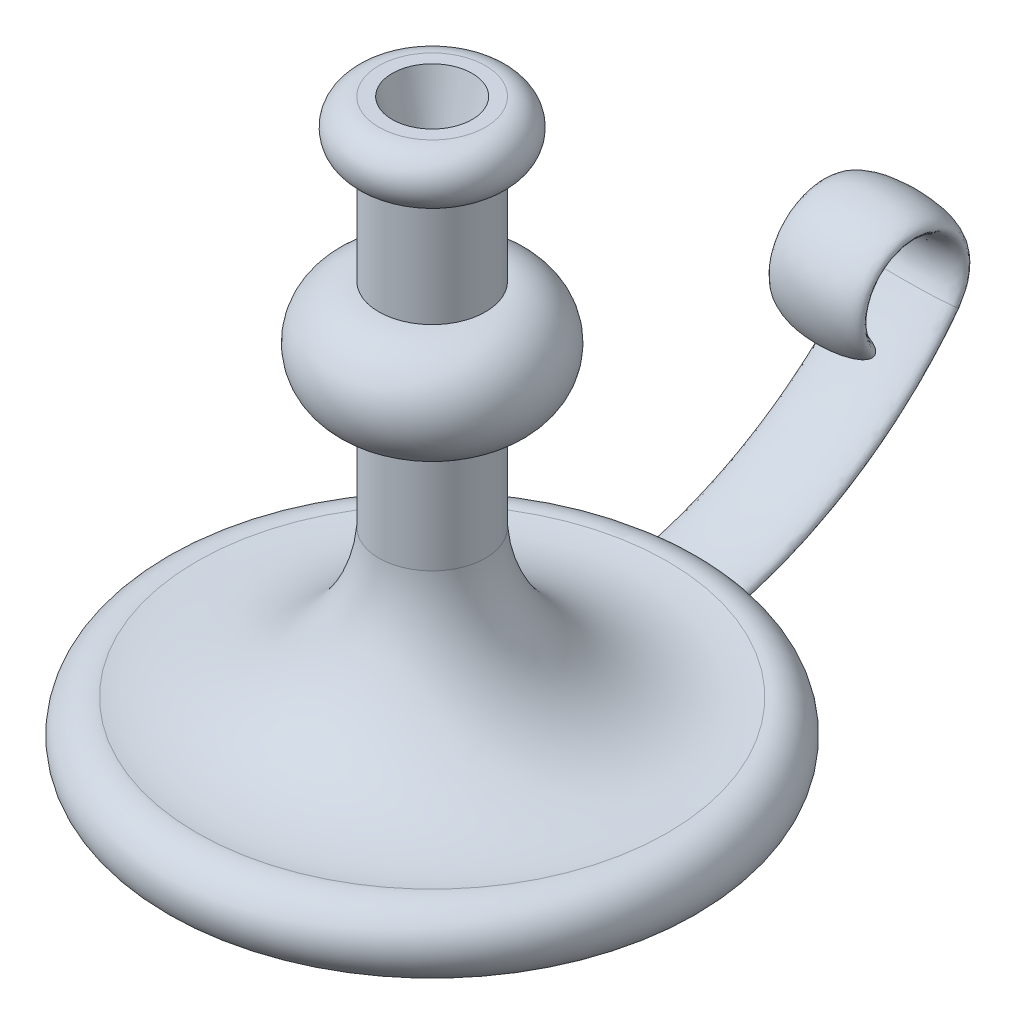
ISO-10303-21;
HEADER;
FILE_DESCRIPTION(('STEP AP214'),'2;1');
FILE_NAME('part.step','',(''),(''),'','','');
FILE_SCHEMA(('AUTOMOTIVE_DESIGN { 1 0 10303 214 1 1 1 1 }'));
ENDSEC;
DATA;
#1=APPLICATION_CONTEXT('core data for automotive mechanical design processes');
#2=APPLICATION_PROTOCOL_DEFINITION('international standard','automotive_design',2000,#1);
#3=PRODUCT_CONTEXT('',#1,'mechanical');
#4=PRODUCT('Part','Part','',(#3));
#5=PRODUCT_RELATED_PRODUCT_CATEGORY('part','',(#4));
#6=PRODUCT_DEFINITION_FORMATION('','',#4);
#7=PRODUCT_DEFINITION_CONTEXT('part definition',#1,'design');
#8=PRODUCT_DEFINITION('design','',#6,#7);
#9=PRODUCT_DEFINITION_SHAPE('','',#8);
#10=(LENGTH_UNIT() NAMED_UNIT(*) SI_UNIT(.MILLI.,.METRE.));
#11=(NAMED_UNIT(*) PLANE_ANGLE_UNIT() SI_UNIT($,.RADIAN.));
#12=(NAMED_UNIT(*) SI_UNIT($,.STERADIAN.) SOLID_ANGLE_UNIT());
#13=UNCERTAINTY_MEASURE_WITH_UNIT(LENGTH_MEASURE(1.E-05),#10,'distance_accuracy_value','');
#14=(GEOMETRIC_REPRESENTATION_CONTEXT(3) GLOBAL_UNCERTAINTY_ASSIGNED_CONTEXT((#13)) GLOBAL_UNIT_ASSIGNED_CONTEXT((#10,
#11,#12)) REPRESENTATION_CONTEXT('',''));
#15=CARTESIAN_POINT('',(0.,0.,0.));
#16=DIRECTION('',(0.,0.,1.));
#17=DIRECTION('',(1.,0.,0.));
#18=AXIS2_PLACEMENT_3D('',#15,#16,#17);
#19=CARTESIAN_POINT('',(0.,12.5,0.));
#20=DIRECTION('',(0.,1.,0.));
#21=DIRECTION('',(0.,0.,1.));
#22=AXIS2_PLACEMENT_3D('',#19,#20,#21);
#23=TOROIDAL_SURFACE('',#22,90.,12.5);
#24=CARTESIAN_POINT('',(0.,24.8768147133355,0.));
#25=DIRECTION('',(0.,1.,0.));
#26=DIRECTION('',(0.,0.,1.));
#27=AXIS2_PLACEMENT_3D('',#24,#25,#26);
#28=CIRCLE('',#27,88.2494407888445);
#29=CARTESIAN_POINT('',(0.,24.8768147133355,88.2494407888445));
#30=VERTEX_POINT('',#29);
#31=EDGE_CURVE('E78',#30,#30,#28,.T.);
#32=ORIENTED_EDGE('',*,*,#31,.F.);
#33=EDGE_LOOP('',(#32));
#34=FACE_BOUND('',#33,.T.);
#35=CARTESIAN_POINT('',(0.,0.,0.));
#36=DIRECTION('',(0.,1.,0.));
#37=DIRECTION('',(0.,0.,1.));
#38=AXIS2_PLACEMENT_3D('',#35,#36,#37);
#39=CIRCLE('',#38,90.);
#40=CARTESIAN_POINT('',(0.,0.,90.));
#41=VERTEX_POINT('',#40);
#42=EDGE_CURVE('E75',#41,#41,#39,.T.);
#43=ORIENTED_EDGE('',*,*,#42,.T.);
#44=EDGE_LOOP('',(#43));
#45=FACE_BOUND('',#44,.T.);
#46=CARTESIAN_POINT('',(-17.5,16.0927546606946,-100.459704957004));
#47=CARTESIAN_POINT('',(-17.4999997813937,16.1354081331705,-100.446712647398));
#48=CARTESIAN_POINT('',(-17.4979059100199,16.1780942344883,-100.433822006738));
#49=CARTESIAN_POINT('',(-17.4896076615809,16.2631476064876,-100.40835061694));
#50=CARTESIAN_POINT('',(-17.4834031158618,16.3055148640154,-100.395769880538));
#51=CARTESIAN_POINT('',(-17.4588636231115,16.4317069436548,-100.358601231694));
#52=CARTESIAN_POINT('',(-17.4346029926943,16.5145956736544,-100.334594903691));
#53=CARTESIAN_POINT('',(-17.3644857421467,16.6975652405625,-100.282370533929));
#54=CARTESIAN_POINT('',(-17.3145591280542,16.7962203137272,-100.254773339427));
#55=CARTESIAN_POINT('',(-17.1992119753299,16.9849169483652,-100.202807799272));
#56=CARTESIAN_POINT('',(-17.1337582407852,17.0749394668665,-100.178446548357));
#57=CARTESIAN_POINT('',(-17.0010895960041,17.2357164837937,-100.135510306638));
#58=CARTESIAN_POINT('',(-16.9351597791246,17.3074649207201,-100.116593510554));
#59=CARTESIAN_POINT('',(-16.7971627938564,17.445356362594,-100.080600163252));
#60=CARTESIAN_POINT('',(-16.7250906247138,17.5114947110188,-100.06352513762));
#61=CARTESIAN_POINT('',(-16.5762015876962,17.6389454303654,-100.030902059111));
#62=CARTESIAN_POINT('',(-16.4993735143119,17.7002455646839,-100.015357854801));
#63=CARTESIAN_POINT('',(-16.3422295543318,17.8184562605972,-99.9856014700973));
#64=CARTESIAN_POINT('',(-16.2619148289213,17.8753682663373,-99.9713888511401));
#65=CARTESIAN_POINT('',(-16.099476553963,17.984737451017,-99.9442451285127));
#66=CARTESIAN_POINT('',(-16.0173843612804,18.037238276819,-99.9313011843415));
#67=CARTESIAN_POINT('',(-15.8510387306853,18.1389478392226,-99.9063546710941));
#68=CARTESIAN_POINT('',(-15.766784929485,18.1881560173692,-99.8943522616494));
#69=CARTESIAN_POINT('',(-15.5111480893597,18.3315515214014,-99.8595252782008));
#70=CARTESIAN_POINT('',(-15.3371321574097,18.4213506043828,-99.8379202246873));
#71=CARTESIAN_POINT('',(-14.9841887322119,18.5915747091448,-99.7971863321513));
#72=CARTESIAN_POINT('',(-14.8052571935687,18.6719917057406,-99.7780596115036));
#73=CARTESIAN_POINT('',(-14.4430931148125,18.8253286918176,-99.7417050439452));
#74=CARTESIAN_POINT('',(-14.2598449828099,18.8982137401208,-99.7244860225141));
#75=CARTESIAN_POINT('',(-13.8909008740039,19.0372057809027,-99.6916923647457));
#76=CARTESIAN_POINT('',(-13.7052078052206,19.1033201263341,-99.6761159439928));
#77=CARTESIAN_POINT('',(-13.3318146173087,19.2297513521302,-99.6463227870181));
#78=CARTESIAN_POINT('',(-13.1441150222504,19.2900697070913,-99.6321057049626));
#79=CARTESIAN_POINT('',(-12.7148488285349,19.4216450558798,-99.6010478511698));
#80=CARTESIAN_POINT('',(-12.4727664182727,19.4913023849978,-99.5845715305432));
#81=CARTESIAN_POINT('',(-11.9865449942012,19.6234725361572,-99.5532015820764));
#82=CARTESIAN_POINT('',(-11.7424057656687,19.6859846020857,-99.5383081217466));
#83=CARTESIAN_POINT('',(-11.2524021667422,19.8047346880934,-99.5098865109373));
#84=CARTESIAN_POINT('',(-11.0065369885878,19.8609695288715,-99.4963590526411));
#85=CARTESIAN_POINT('',(-10.5135139445501,19.9677880463677,-99.4705252839038));
#86=CARTESIAN_POINT('',(-10.2663560164165,20.0183714482784,-99.4582190328485));
#87=CARTESIAN_POINT('',(-9.52474575290428,20.162179813261,-99.4230249470726));
#88=CARTESIAN_POINT('',(-9.02873116267109,20.2478010044574,-99.4017807367104));
#89=CARTESIAN_POINT('',(-8.03403887036177,20.4017582270713,-99.3631257752465));
#90=CARTESIAN_POINT('',(-7.53536176956046,20.470098005473,-99.3457141932542));
#91=CARTESIAN_POINT('',(-6.64098262903011,20.5787778553487,-99.3177181121017));
#92=CARTESIAN_POINT('',(-6.24564521276326,20.6219840960342,-99.3064677659448));
#93=CARTESIAN_POINT('',(-5.45404309771186,20.6995883205487,-99.2861011889293));
#94=CARTESIAN_POINT('',(-5.05777837150171,20.7339860404526,-99.2769850220167));
#95=CARTESIAN_POINT('',(-4.26450254626178,20.7945080196028,-99.2608421942778));
#96=CARTESIAN_POINT('',(-3.8674913209179,20.8206307222007,-99.2538159266064));
#97=CARTESIAN_POINT('',(-3.07299298502188,20.8649662173311,-99.2418333908539));
#98=CARTESIAN_POINT('',(-2.67550586198414,20.8831787975632,-99.2368771783314));
#99=CARTESIAN_POINT('',(-1.48186833179228,20.9263868474955,-99.2250909190306));
#100=CARTESIAN_POINT('',(-0.685243821542716,20.9399001516799,-99.2213574810296));
#101=CARTESIAN_POINT('',(0.907822408883168,20.9371062364336,-99.2221251339179));
#102=CARTESIAN_POINT('',(1.70426413893291,20.9208032646068,-99.2266250518895));
#103=CARTESIAN_POINT('',(3.10465590045767,20.8650704793794,-99.2418065160696));
#104=CARTESIAN_POINT('',(3.70888688648122,20.8321370044005,-99.250743431432));
#105=CARTESIAN_POINT('',(4.91591866145651,20.7474313723199,-99.2734322409465));
#106=CARTESIAN_POINT('',(5.5187195240114,20.6956602068659,-99.287183881642));
#107=CARTESIAN_POINT('',(6.72177664258878,20.5714993449916,-99.3196362799739));
#108=CARTESIAN_POINT('',(7.32203411120081,20.4991209539514,-99.3383343235547));
#109=CARTESIAN_POINT('',(8.2197229377288,20.372883353039,-99.3703690371032));
#110=CARTESIAN_POINT('',(8.51848158405089,20.3278630252531,-99.3817109234693));
#111=CARTESIAN_POINT('',(9.11490185766935,20.2313974791602,-99.4058109485066));
#112=CARTESIAN_POINT('',(9.41256350774172,20.1799523950277,-99.4185690576009));
#113=CARTESIAN_POINT('',(10.1087925825639,20.0510647303076,-99.4502751652067));
#114=CARTESIAN_POINT('',(10.5068095344602,19.9707702542032,-99.4698417955621));
#115=CARTESIAN_POINT('',(11.2995602672652,19.795278484841,-99.5121921918411));
#116=CARTESIAN_POINT('',(11.6942929866897,19.7000765564905,-99.5349769581453));
#117=CARTESIAN_POINT('',(12.2829335623466,19.5436645454322,-99.572155350021));
#118=CARTESIAN_POINT('',(12.4787370627258,19.4892064758694,-99.5850607103732));
#119=CARTESIAN_POINT('',(12.8687752837872,19.3752103880648,-99.6120156305046));
#120=CARTESIAN_POINT('',(13.0630101110597,19.3156727182126,-99.62606511181));
#121=CARTESIAN_POINT('',(13.449405691747,19.1908766381622,-99.6554866020595));
#122=CARTESIAN_POINT('',(13.6415676541029,19.1256217903741,-99.6708577873321));
#123=CARTESIAN_POINT('',(14.0233657907497,18.9884924093214,-99.7031813368274));
#124=CARTESIAN_POINT('',(14.2130023870067,18.9166189982566,-99.7201334330075));
#125=CARTESIAN_POINT('',(14.5271233298256,18.7900033754159,-99.7500787843694));
#126=CARTESIAN_POINT('',(14.6525214539951,18.7374020477042,-99.762540206981));
#127=CARTESIAN_POINT('',(14.9015028286647,18.6282200574177,-99.7884811813502));
#128=CARTESIAN_POINT('',(15.0250857494599,18.5716386824713,-99.8019609154032));
#129=CARTESIAN_POINT('',(15.2700479565199,18.4538955900476,-99.8301287370241));
#130=CARTESIAN_POINT('',(15.391425336985,18.3927301254266,-99.8448178141256));
#131=CARTESIAN_POINT('',(15.6307968186193,18.2653721411134,-99.875576598838));
#132=CARTESIAN_POINT('',(15.7488013829703,18.199198199765,-99.8916412305703));
#133=CARTESIAN_POINT('',(15.9808631150307,18.0607815190154,-99.9254923256409));
#134=CARTESIAN_POINT('',(16.094922730211,17.9885426412831,-99.9432776944338));
#135=CARTESIAN_POINT('',(16.3176642020407,17.8368981515801,-99.9809656969721));
#136=CARTESIAN_POINT('',(16.4263531388456,17.7575023871015,-100.000865428012));
#137=CARTESIAN_POINT('',(16.5950684375099,17.6229168449349,-100.035002473693));
#138=CARTESIAN_POINT('',(16.6574461753785,17.5704622836982,-100.048395393359));
#139=CARTESIAN_POINT('',(16.7787640260731,17.4619437139629,-100.076329644938));
#140=CARTESIAN_POINT('',(16.8377032941248,17.4058788255262,-100.090871257017));
#141=CARTESIAN_POINT('',(16.9510099230454,17.2899250647367,-100.121227214052));
#142=CARTESIAN_POINT('',(17.0053903432458,17.2300480448134,-100.137037650507));
#143=CARTESIAN_POINT('',(17.1084632031359,17.1059999842033,-100.17013961369));
#144=CARTESIAN_POINT('',(17.1571599575767,17.0418322597834,-100.187429999402));
#145=CARTESIAN_POINT('',(17.2538112316031,16.8992652697704,-100.226304996721));
#146=CARTESIAN_POINT('',(17.3006309329571,16.8201525446122,-100.248148577951));
#147=CARTESIAN_POINT('',(17.3814994286755,16.6561401868732,-100.294146076747));
#148=CARTESIAN_POINT('',(17.4155588905477,16.5712454585153,-100.318298043215));
#149=CARTESIAN_POINT('',(17.4546881405159,16.4402373296467,-100.356214705659));
#150=CARTESIAN_POINT('',(17.4657693915847,16.3956610212896,-100.36922342834));
#151=CARTESIAN_POINT('',(17.4834506849953,16.3057690229651,-100.395690140711));
#152=CARTESIAN_POINT('',(17.4900530486047,16.2604537284811,-100.409147893881));
#153=CARTESIAN_POINT('',(17.4985372613483,16.1695080693684,-100.436404058007));
#154=CARTESIAN_POINT('',(17.5004217175524,16.1238778927264,-100.450202276565));
#155=CARTESIAN_POINT('',(17.4994188221183,16.0327507113952,-100.478013254652));
#156=CARTESIAN_POINT('',(17.496531878114,15.9872536956625,-100.492025995752));
#157=CARTESIAN_POINT('',(17.4822555311012,15.8638769917437,-100.53037942142));
#158=CARTESIAN_POINT('',(17.4662073543598,15.7865276750889,-100.55481462111));
#159=CARTESIAN_POINT('',(17.4217101066555,15.635435664406,-100.603294520099));
#160=CARTESIAN_POINT('',(17.3932519180831,15.561695666525,-100.627338918779));
#161=CARTESIAN_POINT('',(17.3094218088041,15.3830119216315,-100.686470031231));
#162=CARTESIAN_POINT('',(17.2477075791741,15.2809015749185,-100.721066718698));
#163=CARTESIAN_POINT('',(17.1085128706004,15.0872159296005,-100.788002474974));
#164=CARTESIAN_POINT('',(17.0309840476184,14.9956743157485,-100.820334202768));
#165=CARTESIAN_POINT('',(16.8711595554946,14.828239765426,-100.880534905053));
#166=CARTESIAN_POINT('',(16.7895872604751,14.7516982388877,-100.908557794304));
#167=CARTESIAN_POINT('',(16.6198192592467,14.6055925560606,-100.962867311498));
#168=CARTESIAN_POINT('',(16.5316173579698,14.5360350714179,-100.989152271216));
#169=CARTESIAN_POINT('',(16.3502573666896,14.4027912701938,-101.040208661481));
#170=CARTESIAN_POINT('',(16.2570906289678,14.3391157633845,-101.064977278228));
#171=CARTESIAN_POINT('',(16.0671681683695,14.2169130843406,-101.11312552152));
#172=CARTESIAN_POINT('',(15.9704136629599,14.1583841879865,-101.136505612364));
#173=CARTESIAN_POINT('',(15.758384931746,14.036705806878,-101.185690771307));
#174=CARTESIAN_POINT('',(15.6426267333752,13.9743179371689,-101.211284384455));
#175=CARTESIAN_POINT('',(15.4082331765951,13.854575655215,-101.261026876667));
#176=CARTESIAN_POINT('',(15.2895974334737,13.7972219207939,-101.28517556104));
#177=CARTESIAN_POINT('',(15.0502835213549,13.6869558389602,-101.332143686537));
#178=CARTESIAN_POINT('',(14.9296091712146,13.6340361002133,-101.354965319562));
#179=CARTESIAN_POINT('',(14.6864760945592,13.5319861823953,-101.39944846796));
#180=CARTESIAN_POINT('',(14.5640174884176,13.482855749076,-101.421110061138));
#181=CARTESIAN_POINT('',(14.2756196483409,13.3717477400142,-101.470587221612));
#182=CARTESIAN_POINT('',(14.1090950753057,13.3111032286767,-101.497982043475));
#183=CARTESIAN_POINT('',(13.7739784451294,13.194974681214,-101.551074952374));
#184=CARTESIAN_POINT('',(13.6053861281183,13.1394913014102,-101.576772823494));
#185=CARTESIAN_POINT('',(13.2663894263082,13.0329894099111,-101.626646437977));
#186=CARTESIAN_POINT('',(13.0959833933303,12.9819754331656,-101.650820628495));
#187=CARTESIAN_POINT('',(12.7538222441394,12.8839601342182,-101.697740232107));
#188=CARTESIAN_POINT('',(12.5820670514772,12.8369590412209,-101.720485563569));
#189=CARTESIAN_POINT('',(12.0649840495489,12.701292954329,-101.786748546328));
#190=CARTESIAN_POINT('',(11.7179818592641,12.618009203439,-101.828272381233));
#191=CARTESIAN_POINT('',(11.0191715037193,12.4629313310291,-101.906771578116));
#192=CARTESIAN_POINT('',(10.6673482043472,12.3911947866737,-101.943723946166));
#193=CARTESIAN_POINT('',(9.9615929432152,12.2580083500012,-102.013226571425));
#194=CARTESIAN_POINT('',(9.60766260084122,12.1965514062008,-102.045779843306));
#195=CARTESIAN_POINT('',(8.8980752415831,12.0826119958036,-102.106800656536));
#196=CARTESIAN_POINT('',(8.54241848268205,12.0301282283483,-102.13526879002));
#197=CARTESIAN_POINT('',(7.81040871858394,11.9305618838954,-102.189778028324));
#198=CARTESIAN_POINT('',(7.43397915247663,11.8839264683218,-102.215603840512));
#199=CARTESIAN_POINT('',(6.67993444714515,11.7987593861203,-102.263146063979));
#200=CARTESIAN_POINT('',(6.30231925232653,11.7602281054355,-102.284862279541));
#201=CARTESIAN_POINT('',(5.54609433737054,11.6906519923906,-102.324327014542));
#202=CARTESIAN_POINT('',(5.16748438045358,11.6596091442679,-102.342074482277));
#203=CARTESIAN_POINT('',(4.40958715674699,11.6045742176863,-102.373695316546));
#204=CARTESIAN_POINT('',(4.03029986993848,11.580582351213,-102.387568566601));
#205=CARTESIAN_POINT('',(2.89367897890388,11.5187707085045,-102.423430450684));
#206=CARTESIAN_POINT('',(2.13559981125369,11.4909363029937,-102.439763858911));
#207=CARTESIAN_POINT('',(0.61890889331227,11.4604729909387,-102.45764620534));
#208=CARTESIAN_POINT('',(-0.13970274424939,11.4578397912758,-102.459197661702));
#209=CARTESIAN_POINT('',(-1.35875503736732,11.4737874359263,-102.44983046648));
#210=CARTESIAN_POINT('',(-1.81935137980266,11.4844469420902,-102.443567606769));
#211=CARTESIAN_POINT('',(-2.74011654741778,11.5152447546293,-102.425548861589));
#212=CARTESIAN_POINT('',(-3.20028538255936,11.5353828342858,-102.413793107504));
#213=CARTESIAN_POINT('',(-4.11996957254696,11.5855216560887,-102.384702146771));
#214=CARTESIAN_POINT('',(-4.57948483563834,11.6155236676045,-102.367366222029));
#215=CARTESIAN_POINT('',(-5.4974581773076,11.6859949069493,-102.326980340762));
#216=CARTESIAN_POINT('',(-5.95591628794017,11.7264638130784,-102.303930559854));
#217=CARTESIAN_POINT('',(-6.73245522224467,11.8047611003026,-102.259807583625));
#218=CARTESIAN_POINT('',(-7.05091964618788,11.8396645822648,-102.240256903582));
#219=CARTESIAN_POINT('',(-7.68694524690595,11.9153974371536,-102.198192202877));
#220=CARTESIAN_POINT('',(-8.00450644313675,11.9562266814357,-102.175678246547));
#221=CARTESIAN_POINT('',(-8.63852813354356,12.0443355142919,-102.127566323068));
#222=CARTESIAN_POINT('',(-8.95498853612305,12.0916156270677,-102.10196810531));
#223=CARTESIAN_POINT('',(-9.58648373894666,12.1932936700264,-102.047535797684));
#224=CARTESIAN_POINT('',(-9.90151858744746,12.2476913573779,-102.018701818215));
#225=CARTESIAN_POINT('',(-10.4355196326157,12.3469675085397,-101.966761020651));
#226=CARTESIAN_POINT('',(-10.6549512455502,12.3898054394411,-101.944531366649));
#227=CARTESIAN_POINT('',(-11.0927391508618,12.4797900783829,-101.898296610944));
#228=CARTESIAN_POINT('',(-11.3110954709833,12.5269366746321,-101.874291555309));
#229=CARTESIAN_POINT('',(-11.7463572052559,12.6259772852336,-101.824412752127));
#230=CARTESIAN_POINT('',(-11.9632635341121,12.6778679277708,-101.798540334514));
#231=CARTESIAN_POINT('',(-12.3954551253196,12.7870218572288,-101.744773203739));
#232=CARTESIAN_POINT('',(-12.6107404570881,12.8442849126529,-101.716878577725));
#233=CARTESIAN_POINT('',(-13.1271302625546,12.9896441483711,-101.647010009244));
#234=CARTESIAN_POINT('',(-13.4272598545052,13.080761095236,-101.603949848743));
#235=CARTESIAN_POINT('',(-13.8733926037732,13.2288604715947,-101.535521709166));
#236=CARTESIAN_POINT('',(-14.021572663426,13.2801879628055,-101.512047288515));
#237=CARTESIAN_POINT('',(-14.3161358117415,13.387165241501,-101.463703536214));
#238=CARTESIAN_POINT('',(-14.4625189862565,13.4428148215448,-101.438834271526));
#239=CARTESIAN_POINT('',(-14.7655954262329,13.5640982166734,-101.385335130791));
#240=CARTESIAN_POINT('',(-14.9220864091757,13.6301792558478,-101.356565997812));
#241=CARTESIAN_POINT('',(-15.2316417152844,13.769291799812,-101.296945167552));
#242=CARTESIAN_POINT('',(-15.3847047925222,13.8423257826971,-101.266092728909));
#243=CARTESIAN_POINT('',(-15.6855752534792,13.9965039024649,-101.202092458902));
#244=CARTESIAN_POINT('',(-15.8333983190986,14.0776204704438,-101.168952541242));
#245=CARTESIAN_POINT('',(-16.1222348319027,14.2500447884753,-101.099877689657));
#246=CARTESIAN_POINT('',(-16.2632544365424,14.3413430659483,-101.06394536294));
#247=CARTESIAN_POINT('',(-16.5064838480583,14.51621387472,-100.996642670942));
#248=CARTESIAN_POINT('',(-16.6106055587576,14.5973538873842,-100.965908772969));
#249=CARTESIAN_POINT('',(-16.8100480106039,14.7696347206809,-100.901912761316));
#250=CARTESIAN_POINT('',(-16.9053500722522,14.8607959113683,-100.868645541933));
#251=CARTESIAN_POINT('',(-17.0386343316046,15.0070049184922,-100.816447186511));
#252=CARTESIAN_POINT('',(-17.0817418294602,15.0577435691703,-100.798518962552));
#253=CARTESIAN_POINT('',(-17.1635483973459,15.1624678123296,-100.761939736429));
#254=CARTESIAN_POINT('',(-17.2022465152741,15.2164541022312,-100.743288579326));
#255=CARTESIAN_POINT('',(-17.2740134525632,15.3275525485191,-100.705371002712));
#256=CARTESIAN_POINT('',(-17.3071042791284,15.3846512646069,-100.68610735837));
#257=CARTESIAN_POINT('',(-17.3665757363378,15.5020086974666,-100.647013519454));
#258=CARTESIAN_POINT('',(-17.3929624857744,15.5622644717602,-100.627183860005));
#259=CARTESIAN_POINT('',(-17.4425946685255,15.6990611960941,-100.582756437489));
#260=CARTESIAN_POINT('',(-17.4639169447251,15.7762993440334,-100.558057482861));
#261=CARTESIAN_POINT('',(-17.4854562623238,15.8939840056237,-100.521035365733));
#262=CARTESIAN_POINT('',(-17.4908953736994,15.9335208689924,-100.508697805933));
#263=CARTESIAN_POINT('',(-17.4981666890214,16.0129472715454,-100.484112154878));
#264=CARTESIAN_POINT('',(-17.5000002045865,16.0528366771782,-100.471864032704));
#265=CARTESIAN_POINT('',(-17.5,16.0927546606946,-100.459704957004));
#266=B_SPLINE_CURVE_WITH_KNOTS('',3,(#46,#47,#48,#49,#50,#51,#52,#53,#54,#55,#56,#57,#58,#59,
#60,#61,#62,#63,#64,#65,#66,#67,#68,#69,#70,#71,#72,#73,#74,#75,#76,#77,#78,#79,#80,#81,#82,#83,
#84,#85,#86,#87,#88,#89,#90,#91,#92,#93,#94,#95,#96,#97,#98,#99,#100,#101,#102,#103,#104,#105,
#106,#107,#108,#109,#110,#111,#112,#113,#114,#115,#116,#117,#118,#119,#120,#121,#122,#123,#124,
#125,#126,#127,#128,#129,#130,#131,#132,#133,#134,#135,#136,#137,#138,#139,#140,#141,#142,#143,
#144,#145,#146,#147,#148,#149,#150,#151,#152,#153,#154,#155,#156,#157,#158,#159,#160,#161,#162,
#163,#164,#165,#166,#167,#168,#169,#170,#171,#172,#173,#174,#175,#176,#177,#178,#179,#180,#181,
#182,#183,#184,#185,#186,#187,#188,#189,#190,#191,#192,#193,#194,#195,#196,#197,#198,#199,#200,
#201,#202,#203,#204,#205,#206,#207,#208,#209,#210,#211,#212,#213,#214,#215,#216,#217,#218,#219,
#220,#221,#222,#223,#224,#225,#226,#227,#228,#229,#230,#231,#232,#233,#234,#235,#236,#237,#238,
#239,#240,#241,#242,#243,#244,#245,#246,#247,#248,#249,#250,#251,#252,#253,#254,#255,#256,#257,
#258,#259,#260,#261,#262,#263,#264,#265),.UNSPECIFIED.,.T.,.F.,(4,2,2,2,2,2,2,2,2,2,2,2,2,2,2,2,
2,2,2,2,2,2,2,2,2,2,2,2,2,2,2,2,2,2,2,2,2,2,2,2,2,2,2,2,2,2,2,2,2,2,2,2,2,2,2,2,2,2,2,2,2,2,2,2,
2,2,2,2,2,2,2,2,2,2,2,2,2,2,2,2,2,2,2,2,2,2,2,2,2,2,2,2,2,2,2,2,2,2,2,2,2,2,2,2,2,2,2,2,2,4),
(0.,0.133715793829871,0.267437074130069,0.534961156762953,0.874959115832902,1.21569062426861,
1.51304333295624,1.81064048523129,2.10896767291311,2.40719625746645,2.70200061828816,
2.99685485382743,3.58743942572676,4.17852552044322,4.77224101542124,5.36530474374874,
5.95821718506518,6.71540594848623,7.47267476370864,8.23032539810686,8.98801285809665,
10.4989889524931,12.0096371531459,13.2030814976991,14.3965615965997,15.590266072926,
16.7840025852151,19.1735865493332,21.562830121654,23.3781269036094,25.1933281391214,
27.0075354452407,27.9145085874559,28.8214627916482,30.0407403890751,31.2603978453481,
31.8712749966297,32.4821102839057,33.0925676265505,33.7029216540006,34.1125218567743,
34.5221955595939,34.9322078706619,35.3407675316309,35.7490689990201,36.1568169996976,
36.4044741569261,36.6521919053134,36.89917389299,37.145967147847,37.4286009197228,
37.7109978808694,37.8540305344867,37.9969890019903,38.1398684545776,38.2827357012124,
38.5295776647753,38.7766012889611,39.1471383245425,39.5188255120374,39.864262047801,
40.2100254904782,40.5564122281809,40.9026824803643,41.3044189874249,41.7062095037798,
42.1073163395688,42.5083962391282,43.0462638744279,43.5841998150528,44.1226754077206,
44.6611817360457,45.7386472884762,46.8213292100963,47.9032653727241,48.9850445517574,
50.1254794223039,51.2659685914997,52.4067596291736,53.5475849608974,55.8232486739876,
58.0985247124313,59.4806970635447,60.8628363560695,62.2451535829719,63.6274283294362,
64.5902699288019,65.5530906286099,66.515989614479,67.4788557575186,68.1528408972141,
68.8268085548569,69.5003008619486,70.1737641616424,71.1231339310702,71.5987706665376,
72.074384587662,72.5911020180827,73.1080043059324,73.6232002112994,74.1379207396594,
74.5440693249659,74.951059312716,75.1577335193784,75.3644522682392,75.5703398988494,
75.7760389358378,76.026360085362,76.1515458512275,76.2766860694591),.UNSPECIFIED.);
#267=CARTESIAN_POINT('',(-17.5,16.0927546606946,-100.459704957004));
#268=VERTEX_POINT('',#267);
#269=EDGE_CURVE('E13',#268,#268,#266,.T.);
#270=ORIENTED_EDGE('',*,*,#269,.F.);
#271=EDGE_LOOP('',(#270));
#272=FACE_BOUND('',#271,.T.);
#273=ADVANCED_FACE('F45',(#34,#45,#272),#23,.T.);
#274=CARTESIAN_POINT('',(0.,220.,0.));
#275=DIRECTION('',(0.,-1.,0.));
#276=DIRECTION('',(0.,0.,-1.));
#277=AXIS2_PLACEMENT_3D('',#274,#275,#276);
#278=PLANE('',#277);
#279=CARTESIAN_POINT('',(0.,220.,0.));
#280=DIRECTION('',(0.,1.,0.));
#281=DIRECTION('',(0.,0.,1.));
#282=AXIS2_PLACEMENT_3D('',#279,#280,#281);
#283=CIRCLE('',#282,15.);
#284=CARTESIAN_POINT('',(0.,220.,15.));
#285=VERTEX_POINT('',#284);
#286=EDGE_CURVE('E68',#285,#285,#283,.T.);
#287=ORIENTED_EDGE('',*,*,#286,.F.);
#288=EDGE_LOOP('',(#287));
#289=FACE_BOUND('',#288,.T.);
#290=CARTESIAN_POINT('',(0.,220.,0.));
#291=DIRECTION('',(0.,1.,0.));
#292=DIRECTION('',(0.,0.,1.));
#293=AXIS2_PLACEMENT_3D('',#290,#291,#292);
#294=CIRCLE('',#293,20.);
#295=CARTESIAN_POINT('',(0.,220.,20.));
#296=VERTEX_POINT('',#295);
#297=EDGE_CURVE('E56',#296,#296,#294,.T.);
#298=ORIENTED_EDGE('',*,*,#297,.T.);
#299=EDGE_LOOP('',(#298));
#300=FACE_BOUND('',#299,.T.);
#301=ADVANCED_FACE('F47',(#289,#300),#278,.F.);
#302=CARTESIAN_POINT('',(0.,210.,0.));
#303=DIRECTION('',(0.,1.,0.));
#304=DIRECTION('',(0.,0.,1.));
#305=AXIS2_PLACEMENT_3D('',#302,#303,#304);
#306=TOROIDAL_SURFACE('',#305,20.,10.);
#307=ORIENTED_EDGE('',*,*,#297,.F.);
#308=EDGE_LOOP('',(#307));
#309=FACE_BOUND('',#308,.T.);
#310=CARTESIAN_POINT('',(0.,200.,0.));
#311=DIRECTION('',(0.,1.,0.));
#312=DIRECTION('',(0.,0.,1.));
#313=AXIS2_PLACEMENT_3D('',#310,#311,#312);
#314=CIRCLE('',#313,20.);
#315=CARTESIAN_POINT('',(0.,200.,20.));
#316=VERTEX_POINT('',#315);
#317=EDGE_CURVE('E90',#316,#316,#314,.T.);
#318=ORIENTED_EDGE('',*,*,#317,.T.);
#319=EDGE_LOOP('',(#318));
#320=FACE_BOUND('',#319,.T.);
#321=ADVANCED_FACE('F96',(#309,#320),#306,.T.);
#322=CARTESIAN_POINT('',(0.,220.,0.));
#323=DIRECTION('',(0.,1.,0.));
#324=DIRECTION('',(0.,0.,1.));
#325=AXIS2_PLACEMENT_3D('',#322,#323,#324);
#326=CYLINDRICAL_SURFACE('',#325,20.);
#327=ORIENTED_EDGE('',*,*,#317,.F.);
#328=EDGE_LOOP('',(#327));
#329=FACE_BOUND('',#328,.T.);
#330=CARTESIAN_POINT('',(0.,160.,0.));
#331=DIRECTION('',(0.,1.,0.));
#332=DIRECTION('',(0.,0.,1.));
#333=AXIS2_PLACEMENT_3D('',#330,#331,#332);
#334=CIRCLE('',#333,20.);
#335=CARTESIAN_POINT('',(0.,160.,20.));
#336=VERTEX_POINT('',#335);
#337=EDGE_CURVE('E87',#336,#336,#334,.T.);
#338=ORIENTED_EDGE('',*,*,#337,.T.);
#339=EDGE_LOOP('',(#338));
#340=FACE_BOUND('',#339,.T.);
#341=ADVANCED_FACE('F99',(#329,#340),#326,.T.);
#342=CARTESIAN_POINT('',(0.,140.,0.));
#343=DIRECTION('',(0.,1.,0.));
#344=DIRECTION('',(0.,0.,1.));
#345=AXIS2_PLACEMENT_3D('',#342,#343,#344);
#346=TOROIDAL_SURFACE('',#345,20.,20.);
#347=ORIENTED_EDGE('',*,*,#337,.F.);
#348=EDGE_LOOP('',(#347));
#349=FACE_BOUND('',#348,.T.);
#350=CARTESIAN_POINT('',(0.,120.,0.));
#351=DIRECTION('',(0.,1.,0.));
#352=DIRECTION('',(0.,0.,1.));
#353=AXIS2_PLACEMENT_3D('',#350,#351,#352);
#354=CIRCLE('',#353,20.);
#355=CARTESIAN_POINT('',(0.,120.,20.));
#356=VERTEX_POINT('',#355);
#357=EDGE_CURVE('E84',#356,#356,#354,.T.);
#358=ORIENTED_EDGE('',*,*,#357,.T.);
#359=EDGE_LOOP('',(#358));
#360=FACE_BOUND('',#359,.T.);
#361=ADVANCED_FACE('F104',(#349,#360),#346,.T.);
#362=CARTESIAN_POINT('',(0.,220.,0.));
#363=DIRECTION('',(0.,1.,0.));
#364=DIRECTION('',(0.,0.,1.));
#365=AXIS2_PLACEMENT_3D('',#362,#363,#364);
#366=CYLINDRICAL_SURFACE('',#365,20.);
#367=ORIENTED_EDGE('',*,*,#357,.F.);
#368=EDGE_LOOP('',(#367));
#369=FACE_BOUND('',#368,.T.);
#370=CARTESIAN_POINT('',(0.,80.,0.));
#371=DIRECTION('',(0.,1.,0.));
#372=DIRECTION('',(0.,0.,1.));
#373=AXIS2_PLACEMENT_3D('',#370,#371,#372);
#374=CIRCLE('',#373,20.);
#375=CARTESIAN_POINT('',(0.,80.,20.));
#376=VERTEX_POINT('',#375);
#377=EDGE_CURVE('E81',#376,#376,#374,.T.);
#378=ORIENTED_EDGE('',*,*,#377,.T.);
#379=EDGE_LOOP('',(#378));
#380=FACE_BOUND('',#379,.T.);
#381=ADVANCED_FACE('F110',(#369,#380),#366,.T.);
#382=CARTESIAN_POINT('',(0.,84.285525337346,0.));
#383=DIRECTION('',(0.,1.,0.));
#384=DIRECTION('',(0.,0.,1.));
#385=AXIS2_PLACEMENT_3D('',#382,#383,#384);
#386=TOROIDAL_SURFACE('',#385,79.8467565752979,60.);
#387=ORIENTED_EDGE('',*,*,#377,.F.);
#388=EDGE_LOOP('',(#387));
#389=FACE_BOUND('',#388,.T.);
#390=ORIENTED_EDGE('',*,*,#31,.T.);
#391=EDGE_LOOP('',(#390));
#392=FACE_BOUND('',#391,.T.);
#393=ADVANCED_FACE('F116',(#389,#392),#386,.F.);
#394=CARTESIAN_POINT('',(0.,0.,0.));
#395=DIRECTION('',(0.,1.,0.));
#396=DIRECTION('',(0.,0.,1.));
#397=AXIS2_PLACEMENT_3D('',#394,#395,#396);
#398=PLANE('',#397);
#399=ORIENTED_EDGE('',*,*,#42,.F.);
#400=EDGE_LOOP('',(#399));
#401=FACE_BOUND('',#400,.T.);
#402=ADVANCED_FACE('F122',(#401),#398,.F.);
#403=CARTESIAN_POINT('',(0.,195.,0.));
#404=DIRECTION('',(0.,1.,0.));
#405=DIRECTION('',(0.,0.,1.));
#406=AXIS2_PLACEMENT_3D('',#403,#404,#405);
#407=CONICAL_SURFACE('',#406,8.30127018922192,0.26179938779915);
#408=ORIENTED_EDGE('',*,*,#286,.T.);
#409=EDGE_LOOP('',(#408));
#410=FACE_BOUND('',#409,.T.);
#411=CARTESIAN_POINT('',(0.,195.,0.));
#412=DIRECTION('',(0.,1.,0.));
#413=DIRECTION('',(0.,0.,1.));
#414=AXIS2_PLACEMENT_3D('',#411,#412,#413);
#415=CIRCLE('',#414,8.30127018922192);
#416=CARTESIAN_POINT('',(0.,195.,8.30127018922192));
#417=VERTEX_POINT('',#416);
#418=EDGE_CURVE('E64',#417,#417,#415,.T.);
#419=ORIENTED_EDGE('',*,*,#418,.F.);
#420=EDGE_LOOP('',(#419));
#421=FACE_BOUND('',#420,.T.);
#422=ADVANCED_FACE('F142',(#410,#421),#407,.F.);
#423=CARTESIAN_POINT('',(0.,195.,0.));
#424=DIRECTION('',(0.,1.,0.));
#425=DIRECTION('',(0.,0.,1.));
#426=AXIS2_PLACEMENT_3D('',#423,#424,#425);
#427=PLANE('',#426);
#428=ORIENTED_EDGE('',*,*,#418,.T.);
#429=EDGE_LOOP('',(#428));
#430=FACE_BOUND('',#429,.T.);
#431=ADVANCED_FACE('F135',(#430),#427,.T.);
#432=CARTESIAN_POINT('',(-17.5,10.5132681929434,-60.));
#433=CARTESIAN_POINT('',(-17.5,10.5132681929434,-107.94262421334));
#434=CARTESIAN_POINT('',(-17.5,31.9538615450943,-150.823810917642));
#435=CARTESIAN_POINT('',(-17.5,70.307960915766,-179.589385445645));
#436=CARTESIAN_POINT('',(-17.5,0.513268192943362,-60.));
#437=CARTESIAN_POINT('',(-17.5,0.513268192943353,-111.149773345158));
#438=CARTESIAN_POINT('',(-17.5,23.3881422396394,-156.89952143855));
#439=CARTESIAN_POINT('',(-17.5,64.307960915766,-187.589385445645));
#440=CARTESIAN_POINT('',(17.5,0.513268192943362,-60.));
#441=CARTESIAN_POINT('',(17.5,0.513268192943353,-111.149773345158));
#442=CARTESIAN_POINT('',(17.5,23.3881422396394,-156.89952143855));
#443=CARTESIAN_POINT('',(17.5,64.307960915766,-187.589385445645));
#444=CARTESIAN_POINT('',(17.5,10.5132681929434,-60.));
#445=CARTESIAN_POINT('',(17.5,10.5132681929434,-107.94262421334));
#446=CARTESIAN_POINT('',(17.5,31.9538615450943,-150.823810917642));
#447=CARTESIAN_POINT('',(17.5,70.307960915766,-179.589385445645));
#448=CARTESIAN_POINT('',(17.5,20.5132681929434,-60.));
#449=CARTESIAN_POINT('',(17.5,20.5132681929433,-104.735475081521));
#450=CARTESIAN_POINT('',(17.5,40.5195808505492,-144.748100396733));
#451=CARTESIAN_POINT('',(17.5,76.307960915766,-171.589385445645));
#452=CARTESIAN_POINT('',(-17.5,20.5132681929434,-60.));
#453=CARTESIAN_POINT('',(-17.5,20.5132681929433,-104.735475081521));
#454=CARTESIAN_POINT('',(-17.5,40.5195808505492,-144.748100396733));
#455=CARTESIAN_POINT('',(-17.5,76.307960915766,-171.589385445645));
#456=CARTESIAN_POINT('',(-17.5,10.5132681929434,-60.));
#457=CARTESIAN_POINT('',(-17.5,10.5132681929434,-107.94262421334));
#458=CARTESIAN_POINT('',(-17.5,31.9538615450943,-150.823810917642));
#459=CARTESIAN_POINT('',(-17.5,70.307960915766,-179.589385445645));
#460=(BOUNDED_SURFACE() B_SPLINE_SURFACE(3,3,((#432,#433,#434,#435),(#436,#437,#438,#439),(#440,
#441,#442,#443),(#444,#445,#446,#447),(#448,#449,#450,#451),(#452,#453,#454,#455),(#456,#457,
#458,#459)),.UNSPECIFIED.,.T.,.F.,.F.) B_SPLINE_SURFACE_WITH_KNOTS((4,3,4),(4,4),(0.,0.5,1.),
(0.,1.),.UNSPECIFIED.) GEOMETRIC_REPRESENTATION_ITEM() RATIONAL_B_SPLINE_SURFACE(((1.,
0.929618127333277,0.929618127333277,1.),(0.333333333333333,0.309872709111092,0.309872709111092,
0.333333333333333),(0.333333333333333,0.309872709111092,0.309872709111092,0.333333333333333),
(1.,0.929618127333277,0.929618127333277,1.),(0.333333333333333,0.309872709111092,
0.309872709111092,0.333333333333333),(0.333333333333333,0.309872709111092,0.309872709111092,
0.333333333333333),(1.,0.929618127333277,0.929618127333277,1.))) REPRESENTATION_ITEM('') SURFACE());
#461=CARTESIAN_POINT('',(0.,70.307960915766,-179.589385445645));
#462=DIRECTION('',(0.,-0.8,0.6));
#463=DIRECTION('',(-1.,0.,0.));
#464=AXIS2_PLACEMENT_3D('',#461,#462,#463);
#465=ELLIPSE('',#464,17.5,5.);
#466=CARTESIAN_POINT('',(-17.5,70.307960915766,-179.589385445645));
#467=VERTEX_POINT('',#466);
#468=EDGE_CURVE('E65',#467,#467,#465,.T.);
#469=ORIENTED_EDGE('',*,*,#468,.T.);
#470=EDGE_LOOP('',(#469));
#471=FACE_BOUND('',#470,.T.);
#472=ORIENTED_EDGE('',*,*,#269,.T.);
#473=EDGE_LOOP('',(#472));
#474=FACE_BOUND('',#473,.T.);
#475=ADVANCED_FACE('F132',(#471,#474),#460,.F.);
#476=CARTESIAN_POINT('',(0.,70.307960915766,-148.410614554355));
#477=DIRECTION('',(0.,0.8,0.6));
#478=DIRECTION('',(1.,0.,0.));
#479=AXIS2_PLACEMENT_3D('',#476,#477,#478);
#480=PLANE('',#479);
#481=CARTESIAN_POINT('',(0.,70.307960915766,-148.410614554355));
#482=DIRECTION('',(0.,0.8,0.6));
#483=DIRECTION('',(-1.,0.,0.));
#484=AXIS2_PLACEMENT_3D('',#481,#482,#483);
#485=ELLIPSE('',#484,17.5,5.);
#486=CARTESIAN_POINT('',(-17.5,70.307960915766,-148.410614554355));
#487=VERTEX_POINT('',#486);
#488=EDGE_CURVE('E60',#487,#487,#485,.T.);
#489=ORIENTED_EDGE('',*,*,#488,.F.);
#490=EDGE_LOOP('',(#489));
#491=FACE_BOUND('',#490,.T.);
#492=ADVANCED_FACE('F134',(#491),#480,.F.);
#493=CARTESIAN_POINT('',(-17.5,70.307960915766,-179.589385445645));
#494=CARTESIAN_POINT('',(-17.5,85.0285796862386,-190.6298495235));
#495=CARTESIAN_POINT('',(-17.5,101.486731807057,-182.400773463091));
#496=CARTESIAN_POINT('',(-17.5,101.486731807057,-164.));
#497=CARTESIAN_POINT('',(-17.5,101.486731807057,-145.599226536909));
#498=CARTESIAN_POINT('',(-17.5,85.0285796862386,-137.3701504765));
#499=CARTESIAN_POINT('',(-17.5,70.307960915766,-148.410614554355));
#500=CARTESIAN_POINT('',(-17.5,64.307960915766,-187.589385445645));
#501=CARTESIAN_POINT('',(-17.5,86.5827549662318,-204.295480983495));
#502=CARTESIAN_POINT('',(-17.5,111.486731807057,-191.843492563082));
#503=CARTESIAN_POINT('',(-17.5,111.486731807057,-164.));
#504=CARTESIAN_POINT('',(-17.5,111.486731807057,-136.156507436918));
#505=CARTESIAN_POINT('',(-17.5,86.5827549662319,-123.704519016505));
#506=CARTESIAN_POINT('',(-17.5,64.307960915766,-140.410614554355));
#507=CARTESIAN_POINT('',(17.5,64.307960915766,-187.589385445645));
#508=CARTESIAN_POINT('',(17.5,86.5827549662318,-204.295480983495));
#509=CARTESIAN_POINT('',(17.5,111.486731807057,-191.843492563082));
#510=CARTESIAN_POINT('',(17.5,111.486731807057,-164.));
#511=CARTESIAN_POINT('',(17.5,111.486731807057,-136.156507436918));
#512=CARTESIAN_POINT('',(17.5,86.5827549662319,-123.704519016505));
#513=CARTESIAN_POINT('',(17.5,64.307960915766,-140.410614554355));
#514=CARTESIAN_POINT('',(17.5,70.307960915766,-179.589385445645));
#515=CARTESIAN_POINT('',(17.5,85.0285796862386,-190.6298495235));
#516=CARTESIAN_POINT('',(17.5,101.486731807057,-182.400773463091));
#517=CARTESIAN_POINT('',(17.5,101.486731807057,-164.));
#518=CARTESIAN_POINT('',(17.5,101.486731807057,-145.599226536909));
#519=CARTESIAN_POINT('',(17.5,85.0285796862386,-137.3701504765));
#520=CARTESIAN_POINT('',(17.5,70.307960915766,-148.410614554355));
#521=CARTESIAN_POINT('',(17.5,76.307960915766,-171.589385445645));
#522=CARTESIAN_POINT('',(17.5,83.4744044062453,-176.964218063505));
#523=CARTESIAN_POINT('',(17.5,91.4867318070567,-172.958054363099));
#524=CARTESIAN_POINT('',(17.5,91.4867318070566,-164.));
#525=CARTESIAN_POINT('',(17.5,91.4867318070566,-155.041945636901));
#526=CARTESIAN_POINT('',(17.5,83.4744044062453,-151.035781936495));
#527=CARTESIAN_POINT('',(17.5,76.307960915766,-156.410614554355));
#528=CARTESIAN_POINT('',(-17.5,76.307960915766,-171.589385445645));
#529=CARTESIAN_POINT('',(-17.5,83.4744044062453,-176.964218063505));
#530=CARTESIAN_POINT('',(-17.5,91.4867318070567,-172.958054363099));
#531=CARTESIAN_POINT('',(-17.5,91.4867318070566,-164.));
#532=CARTESIAN_POINT('',(-17.5,91.4867318070566,-155.041945636901));
#533=CARTESIAN_POINT('',(-17.5,83.4744044062453,-151.035781936495));
#534=CARTESIAN_POINT('',(-17.5,76.307960915766,-156.410614554355));
#535=CARTESIAN_POINT('',(-17.5,70.307960915766,-179.589385445645));
#536=CARTESIAN_POINT('',(-17.5,85.0285796862386,-190.6298495235));
#537=CARTESIAN_POINT('',(-17.5,101.486731807057,-182.400773463091));
#538=CARTESIAN_POINT('',(-17.5,101.486731807057,-164.));
#539=CARTESIAN_POINT('',(-17.5,101.486731807057,-145.599226536909));
#540=CARTESIAN_POINT('',(-17.5,85.0285796862386,-137.3701504765));
#541=CARTESIAN_POINT('',(-17.5,70.307960915766,-148.410614554355));
#542=(BOUNDED_SURFACE() B_SPLINE_SURFACE(3,3,((#493,#494,#495,#496,#497,#498,#499),(#500,#501,
#502,#503,#504,#505,#506),(#507,#508,#509,#510,#511,#512,#513),(#514,#515,#516,#517,#518,#519,
#520),(#521,#522,#523,#524,#525,#526,#527),(#528,#529,#530,#531,#532,#533,#534),(#535,#536,#537,
#538,#539,#540,#541)),.UNSPECIFIED.,.T.,.F.,.F.) B_SPLINE_SURFACE_WITH_KNOTS((4,3,4),(4,3,4),
(0.,0.5,1.),(0.,0.5,1.),
.UNSPECIFIED.) GEOMETRIC_REPRESENTATION_ITEM() RATIONAL_B_SPLINE_SURFACE(((1.,0.631475730333305,
0.631475730333305,1.,0.631475730333305,0.631475730333305,1.),(0.333333333333333,
0.210491910111102,0.210491910111102,0.333333333333333,0.210491910111102,0.210491910111102,
0.333333333333333),(0.333333333333333,0.210491910111102,0.210491910111102,0.333333333333333,
0.210491910111102,0.210491910111102,0.333333333333333),(1.,0.631475730333305,0.631475730333305,
1.,0.631475730333305,0.631475730333305,1.),(0.333333333333333,0.210491910111102,
0.210491910111102,0.333333333333333,0.210491910111102,0.210491910111102,0.333333333333333),
(0.333333333333333,0.210491910111102,0.210491910111102,0.333333333333333,0.210491910111102,
0.210491910111102,0.333333333333333),(1.,0.631475730333305,0.631475730333305,1.,
0.631475730333305,0.631475730333305,1.))) REPRESENTATION_ITEM('') SURFACE());
#543=ORIENTED_EDGE('',*,*,#488,.T.);
#544=EDGE_LOOP('',(#543));
#545=FACE_BOUND('',#544,.T.);
#546=ORIENTED_EDGE('',*,*,#468,.F.);
#547=EDGE_LOOP('',(#546));
#548=FACE_BOUND('',#547,.T.);
#549=ADVANCED_FACE('F61',(#545,#548),#542,.F.);
#550=CLOSED_SHELL('',(#273,#301,#321,#341,#361,#381,#393,#402,#422,#431,#475,#492,#549));
#551=MANIFOLD_SOLID_BREP('B2',#550);
#552=ADVANCED_BREP_SHAPE_REPRESENTATION('',(#18,#551),#14);
#553=SHAPE_DEFINITION_REPRESENTATION(#9,#552);
ENDSEC;
END-ISO-10303-21;
